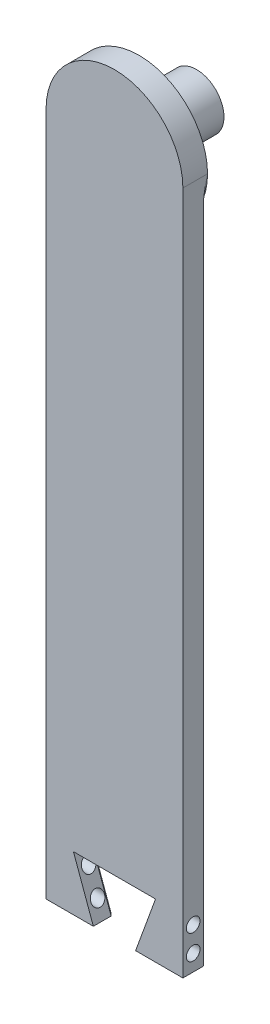
ISO-10303-21;
HEADER;
FILE_DESCRIPTION(('STEP AP214'),'2;1');
FILE_NAME('part.step','',(''),(''),'','','');
FILE_SCHEMA(('AUTOMOTIVE_DESIGN { 1 0 10303 214 1 1 1 1 }'));
ENDSEC;
DATA;
#1=APPLICATION_CONTEXT('core data for automotive mechanical design processes');
#2=APPLICATION_PROTOCOL_DEFINITION('international standard','automotive_design',2000,#1);
#3=PRODUCT_CONTEXT('',#1,'mechanical');
#4=PRODUCT('Part','Part','',(#3));
#5=PRODUCT_RELATED_PRODUCT_CATEGORY('part','',(#4));
#6=PRODUCT_DEFINITION_FORMATION('','',#4);
#7=PRODUCT_DEFINITION_CONTEXT('part definition',#1,'design');
#8=PRODUCT_DEFINITION('design','',#6,#7);
#9=PRODUCT_DEFINITION_SHAPE('','',#8);
#10=(LENGTH_UNIT() NAMED_UNIT(*) SI_UNIT(.MILLI.,.METRE.));
#11=(NAMED_UNIT(*) PLANE_ANGLE_UNIT() SI_UNIT($,.RADIAN.));
#12=(NAMED_UNIT(*) SI_UNIT($,.STERADIAN.) SOLID_ANGLE_UNIT());
#13=UNCERTAINTY_MEASURE_WITH_UNIT(LENGTH_MEASURE(1.E-05),#10,'distance_accuracy_value','');
#14=(GEOMETRIC_REPRESENTATION_CONTEXT(3) GLOBAL_UNCERTAINTY_ASSIGNED_CONTEXT((#13)) GLOBAL_UNIT_ASSIGNED_CONTEXT((#10,
#11,#12)) REPRESENTATION_CONTEXT('',''));
#15=CARTESIAN_POINT('',(0.,0.,0.));
#16=DIRECTION('',(0.,0.,1.));
#17=DIRECTION('',(1.,0.,0.));
#18=AXIS2_PLACEMENT_3D('',#15,#16,#17);
#19=CARTESIAN_POINT('',(-25.,-250.,-25.001));
#20=DIRECTION('',(0.,1.,0.));
#21=DIRECTION('',(0.,0.,1.));
#22=AXIS2_PLACEMENT_3D('',#19,#20,#21);
#23=PLANE('',#22);
#24=DIRECTION('',(-1.,0.,0.));
#25=VECTOR('',#24,1.);
#26=CARTESIAN_POINT('',(-25.,-250.,-2.5));
#27=LINE('',#26,#25);
#28=CARTESIAN_POINT('',(-8.78477308715179,-250.,-2.5));
#29=VERTEX_POINT('',#28);
#30=CARTESIAN_POINT('',(-25.,-250.,-2.50000000000001));
#31=VERTEX_POINT('',#30);
#32=EDGE_CURVE('E424',#29,#31,#27,.T.);
#33=ORIENTED_EDGE('',*,*,#32,.F.);
#34=DIRECTION('',(0.728739444818692,0.,0.684791078771726));
#35=VECTOR('',#34,1.);
#36=CARTESIAN_POINT('',(-50.9089854638326,-250.,-42.0838115267843));
#37=LINE('',#36,#35);
#38=CARTESIAN_POINT('',(-7.72059531467585,-250.,-1.50000000000002));
#39=VERTEX_POINT('',#38);
#40=EDGE_CURVE('E384',#29,#39,#37,.T.);
#41=ORIENTED_EDGE('',*,*,#40,.T.);
#42=DIRECTION('',(0.,0.,1.));
#43=VECTOR('',#42,1.);
#44=CARTESIAN_POINT('',(-7.72059531467585,-250.,-25.001));
#45=LINE('',#44,#43);
#46=CARTESIAN_POINT('',(-7.72059531467585,-250.,5.));
#47=VERTEX_POINT('',#46);
#48=EDGE_CURVE('E421',#39,#47,#45,.T.);
#49=ORIENTED_EDGE('',*,*,#48,.T.);
#50=DIRECTION('',(-1.,0.,0.));
#51=VECTOR('',#50,1.);
#52=CARTESIAN_POINT('',(-25.,-250.,5.));
#53=LINE('',#52,#51);
#54=CARTESIAN_POINT('',(-25.,-250.,5.));
#55=VERTEX_POINT('',#54);
#56=EDGE_CURVE('E171',#47,#55,#53,.T.);
#57=ORIENTED_EDGE('',*,*,#56,.T.);
#58=DIRECTION('',(0.,0.,-1.));
#59=VECTOR('',#58,1.);
#60=CARTESIAN_POINT('',(-25.,-250.,5.));
#61=LINE('',#60,#59);
#62=EDGE_CURVE('E234',#55,#31,#61,.T.);
#63=ORIENTED_EDGE('',*,*,#62,.T.);
#64=EDGE_LOOP('',(#33,#41,#49,#57,#63));
#65=FACE_BOUND('',#64,.T.);
#66=ADVANCED_FACE('F47',(#65),#23,.F.);
#67=CARTESIAN_POINT('',(0.,0.,-25.));
#68=DIRECTION('',(0.,0.,1.));
#69=DIRECTION('',(1.,0.,0.));
#70=AXIS2_PLACEMENT_3D('',#67,#68,#69);
#71=CYLINDRICAL_SURFACE('',#70,10.);
#72=CARTESIAN_POINT('',(0.,0.,-6.));
#73=DIRECTION('',(0.,0.,1.));
#74=DIRECTION('',(1.,0.,0.));
#75=AXIS2_PLACEMENT_3D('',#72,#73,#74);
#76=CIRCLE('',#75,10.);
#77=CARTESIAN_POINT('',(10.,0.,-6.));
#78=VERTEX_POINT('',#77);
#79=EDGE_CURVE('E370',#78,#78,#76,.F.);
#80=ORIENTED_EDGE('',*,*,#79,.T.);
#81=EDGE_LOOP('',(#80));
#82=FACE_BOUND('',#81,.T.);
#83=CARTESIAN_POINT('',(0.,0.,-25.));
#84=DIRECTION('',(0.,0.,-1.));
#85=DIRECTION('',(-1.,0.,0.));
#86=AXIS2_PLACEMENT_3D('',#83,#84,#85);
#87=CIRCLE('',#86,10.);
#88=CARTESIAN_POINT('',(-10.,0.,-25.));
#89=VERTEX_POINT('',#88);
#90=EDGE_CURVE('E210',#89,#89,#87,.T.);
#91=ORIENTED_EDGE('',*,*,#90,.F.);
#92=EDGE_LOOP('',(#91));
#93=FACE_BOUND('',#92,.T.);
#94=ADVANCED_FACE('F308',(#82,#93),#71,.T.);
#95=CARTESIAN_POINT('',(0.,0.,-25.));
#96=DIRECTION('',(0.,0.,-1.));
#97=DIRECTION('',(-1.,0.,0.));
#98=AXIS2_PLACEMENT_3D('',#95,#96,#97);
#99=PLANE('',#98);
#100=CARTESIAN_POINT('',(0.,0.,-25.));
#101=DIRECTION('',(0.,0.,-1.));
#102=DIRECTION('',(-1.,0.,0.));
#103=AXIS2_PLACEMENT_3D('',#100,#101,#102);
#104=CIRCLE('',#103,3.);
#105=CARTESIAN_POINT('',(-2.5,1.6583123951777,-25.));
#106=VERTEX_POINT('',#105);
#107=CARTESIAN_POINT('',(-2.5,-1.6583123951777,-25.));
#108=VERTEX_POINT('',#107);
#109=EDGE_CURVE('E191',#106,#108,#104,.T.);
#110=ORIENTED_EDGE('',*,*,#109,.F.);
#111=DIRECTION('',(0.,1.,0.));
#112=VECTOR('',#111,1.);
#113=CARTESIAN_POINT('',(-2.5,1.6583123951777,-25.));
#114=LINE('',#113,#112);
#115=EDGE_CURVE('E197',#108,#106,#114,.T.);
#116=ORIENTED_EDGE('',*,*,#115,.F.);
#117=EDGE_LOOP('',(#110,#116));
#118=FACE_BOUND('',#117,.T.);
#119=ORIENTED_EDGE('',*,*,#90,.T.);
#120=EDGE_LOOP('',(#119));
#121=FACE_BOUND('',#120,.T.);
#122=ADVANCED_FACE('F314',(#118,#121),#99,.T.);
#123=CARTESIAN_POINT('',(0.,0.,-15.));
#124=DIRECTION('',(0.,0.,-1.));
#125=DIRECTION('',(-1.,0.,0.));
#126=AXIS2_PLACEMENT_3D('',#123,#124,#125);
#127=CYLINDRICAL_SURFACE('',#126,3.);
#128=ORIENTED_EDGE('',*,*,#109,.T.);
#129=DIRECTION('',(0.,0.,-1.));
#130=VECTOR('',#129,1.);
#131=CARTESIAN_POINT('',(-2.5,-1.6583123951777,-15.));
#132=LINE('',#131,#130);
#133=CARTESIAN_POINT('',(-2.5,-1.6583123951777,-15.));
#134=VERTEX_POINT('',#133);
#135=EDGE_CURVE('E201',#134,#108,#132,.T.);
#136=ORIENTED_EDGE('',*,*,#135,.F.);
#137=CARTESIAN_POINT('',(0.,0.,-15.));
#138=DIRECTION('',(0.,0.,-1.));
#139=DIRECTION('',(-1.,0.,0.));
#140=AXIS2_PLACEMENT_3D('',#137,#138,#139);
#141=CIRCLE('',#140,3.);
#142=CARTESIAN_POINT('',(-2.5,1.6583123951777,-15.));
#143=VERTEX_POINT('',#142);
#144=EDGE_CURVE('E192',#143,#134,#141,.T.);
#145=ORIENTED_EDGE('',*,*,#144,.F.);
#146=DIRECTION('',(0.,0.,-1.));
#147=VECTOR('',#146,1.);
#148=CARTESIAN_POINT('',(-2.5,1.6583123951777,-15.));
#149=LINE('',#148,#147);
#150=EDGE_CURVE('E207',#143,#106,#149,.T.);
#151=ORIENTED_EDGE('',*,*,#150,.T.);
#152=EDGE_LOOP('',(#128,#136,#145,#151));
#153=FACE_BOUND('',#152,.T.);
#154=ADVANCED_FACE('F468',(#153),#127,.F.);
#155=CARTESIAN_POINT('',(-2.5,1.6583123951777,-15.));
#156=DIRECTION('',(-1.,0.,0.));
#157=DIRECTION('',(0.,0.,1.));
#158=AXIS2_PLACEMENT_3D('',#155,#156,#157);
#159=PLANE('',#158);
#160=ORIENTED_EDGE('',*,*,#115,.T.);
#161=ORIENTED_EDGE('',*,*,#150,.F.);
#162=DIRECTION('',(0.,1.,0.));
#163=VECTOR('',#162,1.);
#164=CARTESIAN_POINT('',(-2.5,1.6583123951777,-15.));
#165=LINE('',#164,#163);
#166=EDGE_CURVE('E196',#134,#143,#165,.T.);
#167=ORIENTED_EDGE('',*,*,#166,.F.);
#168=ORIENTED_EDGE('',*,*,#135,.T.);
#169=EDGE_LOOP('',(#160,#161,#167,#168));
#170=FACE_BOUND('',#169,.T.);
#171=ADVANCED_FACE('F459',(#170),#159,.F.);
#172=CARTESIAN_POINT('',(0.,0.,-15.));
#173=DIRECTION('',(0.,0.,-1.));
#174=DIRECTION('',(-1.,0.,0.));
#175=AXIS2_PLACEMENT_3D('',#172,#173,#174);
#176=PLANE('',#175);
#177=ORIENTED_EDGE('',*,*,#144,.T.);
#178=ORIENTED_EDGE('',*,*,#166,.T.);
#179=EDGE_LOOP('',(#177,#178));
#180=FACE_BOUND('',#179,.T.);
#181=ADVANCED_FACE('F453',(#180),#176,.T.);
#182=CARTESIAN_POINT('',(0.,0.,-4.));
#183=DIRECTION('',(0.,0.,-1.));
#184=DIRECTION('',(-1.,0.,0.));
#185=AXIS2_PLACEMENT_3D('',#182,#183,#184);
#186=PLANE('',#185);
#187=CARTESIAN_POINT('',(0.,0.,-4.));
#188=DIRECTION('',(0.,0.,-1.));
#189=DIRECTION('',(-1.,0.,0.));
#190=AXIS2_PLACEMENT_3D('',#187,#188,#189);
#191=CIRCLE('',#190,12.);
#192=CARTESIAN_POINT('',(-12.,0.,-4.));
#193=VERTEX_POINT('',#192);
#194=EDGE_CURVE('E170',#193,#193,#191,.T.);
#195=ORIENTED_EDGE('',*,*,#194,.F.);
#196=EDGE_LOOP('',(#195));
#197=FACE_BOUND('',#196,.T.);
#198=CARTESIAN_POINT('',(0.,0.,-4.));
#199=DIRECTION('',(0.,0.,-1.));
#200=DIRECTION('',(-1.,0.,0.));
#201=AXIS2_PLACEMENT_3D('',#198,#199,#200);
#202=CIRCLE('',#201,25.);
#203=CARTESIAN_POINT('',(-25.,0.,-4.));
#204=VERTEX_POINT('',#203);
#205=CARTESIAN_POINT('',(25.,0.,-4.));
#206=VERTEX_POINT('',#205);
#207=EDGE_CURVE('E176',#204,#206,#202,.T.);
#208=ORIENTED_EDGE('',*,*,#207,.T.);
#209=CARTESIAN_POINT('',(0.,0.,-4.));
#210=DIRECTION('',(0.,0.,-1.));
#211=DIRECTION('',(-1.,0.,0.));
#212=AXIS2_PLACEMENT_3D('',#209,#210,#211);
#213=CIRCLE('',#212,25.);
#214=EDGE_CURVE('E246',#206,#204,#213,.T.);
#215=ORIENTED_EDGE('',*,*,#214,.T.);
#216=EDGE_LOOP('',(#208,#215));
#217=FACE_BOUND('',#216,.T.);
#218=ADVANCED_FACE('F451',(#197,#217),#186,.T.);
#219=CARTESIAN_POINT('',(0.,0.,5.));
#220=DIRECTION('',(0.,0.,1.));
#221=DIRECTION('',(1.,0.,0.));
#222=AXIS2_PLACEMENT_3D('',#219,#220,#221);
#223=PLANE('',#222);
#224=DIRECTION('',(0.342020143325673,-0.939692620785907,0.));
#225=VECTOR('',#224,1.);
#226=CARTESIAN_POINT('',(-7.72059531467585,-250.,5.));
#227=LINE('',#226,#225);
#228=CARTESIAN_POINT('',(-15.,-230.,5.));
#229=VERTEX_POINT('',#228);
#230=EDGE_CURVE('E153',#229,#47,#227,.T.);
#231=ORIENTED_EDGE('',*,*,#230,.F.);
#232=DIRECTION('',(-1.,0.,0.));
#233=VECTOR('',#232,1.);
#234=CARTESIAN_POINT('',(-15.,-230.,5.));
#235=LINE('',#234,#233);
#236=CARTESIAN_POINT('',(15.,-230.,5.));
#237=VERTEX_POINT('',#236);
#238=EDGE_CURVE('E162',#237,#229,#235,.T.);
#239=ORIENTED_EDGE('',*,*,#238,.F.);
#240=DIRECTION('',(0.342020143325672,0.939692620785907,0.));
#241=VECTOR('',#240,1.);
#242=CARTESIAN_POINT('',(15.,-230.,5.));
#243=LINE('',#242,#241);
#244=CARTESIAN_POINT('',(7.72059531467585,-250.,5.));
#245=VERTEX_POINT('',#244);
#246=EDGE_CURVE('E146',#245,#237,#243,.T.);
#247=ORIENTED_EDGE('',*,*,#246,.F.);
#248=CARTESIAN_POINT('',(25.,-250.,5.));
#249=VERTEX_POINT('',#248);
#250=EDGE_CURVE('E159',#249,#245,#53,.T.);
#251=ORIENTED_EDGE('',*,*,#250,.F.);
#252=DIRECTION('',(0.,1.,0.));
#253=VECTOR('',#252,1.);
#254=CARTESIAN_POINT('',(25.,0.,5.));
#255=LINE('',#254,#253);
#256=CARTESIAN_POINT('',(25.,0.,5.));
#257=VERTEX_POINT('',#256);
#258=EDGE_CURVE('E225',#249,#257,#255,.T.);
#259=ORIENTED_EDGE('',*,*,#258,.T.);
#260=CARTESIAN_POINT('',(0.,0.,5.));
#261=DIRECTION('',(0.,0.,1.));
#262=DIRECTION('',(1.,0.,0.));
#263=AXIS2_PLACEMENT_3D('',#260,#261,#262);
#264=CIRCLE('',#263,25.);
#265=CARTESIAN_POINT('',(-25.,0.,5.));
#266=VERTEX_POINT('',#265);
#267=EDGE_CURVE('E217',#257,#266,#264,.T.);
#268=ORIENTED_EDGE('',*,*,#267,.T.);
#269=DIRECTION('',(0.,-1.,0.));
#270=VECTOR('',#269,1.);
#271=CARTESIAN_POINT('',(-25.,0.,5.));
#272=LINE('',#271,#270);
#273=EDGE_CURVE('E221',#266,#55,#272,.T.);
#274=ORIENTED_EDGE('',*,*,#273,.T.);
#275=ORIENTED_EDGE('',*,*,#56,.F.);
#276=EDGE_LOOP('',(#231,#239,#247,#251,#259,#268,#274,#275));
#277=FACE_BOUND('',#276,.T.);
#278=ADVANCED_FACE('F158',(#277),#223,.T.);
#279=CARTESIAN_POINT('',(0.,0.,-2.5));
#280=DIRECTION('',(0.,0.,-1.));
#281=DIRECTION('',(-1.,0.,0.));
#282=AXIS2_PLACEMENT_3D('',#279,#280,#281);
#283=PLANE('',#282);
#284=DIRECTION('',(-1.,0.,0.));
#285=VECTOR('',#284,1.);
#286=CARTESIAN_POINT('',(-15.,-229.,-2.5));
#287=LINE('',#286,#285);
#288=CARTESIAN_POINT('',(16.4281480067421,-229.,-2.5));
#289=VERTEX_POINT('',#288);
#290=CARTESIAN_POINT('',(-16.4281480067421,-229.,-2.5));
#291=VERTEX_POINT('',#290);
#292=EDGE_CURVE('E377',#289,#291,#287,.T.);
#293=ORIENTED_EDGE('',*,*,#292,.T.);
#294=DIRECTION('',(0.342020143325673,-0.939692620785907,0.));
#295=VECTOR('',#294,1.);
#296=CARTESIAN_POINT('',(-8.66028793546178,-250.342020143326,-2.5));
#297=LINE('',#296,#295);
#298=EDGE_CURVE('E380',#291,#29,#297,.T.);
#299=ORIENTED_EDGE('',*,*,#298,.T.);
#300=ORIENTED_EDGE('',*,*,#32,.T.);
#301=DIRECTION('',(0.,1.,0.));
#302=VECTOR('',#301,1.);
#303=CARTESIAN_POINT('',(-25.,-250.,-2.5));
#304=LINE('',#303,#302);
#305=CARTESIAN_POINT('',(-25.,-8.78919791562346,-2.5));
#306=VERTEX_POINT('',#305);
#307=EDGE_CURVE('E187',#31,#306,#304,.T.);
#308=ORIENTED_EDGE('',*,*,#307,.T.);
#309=CARTESIAN_POINT('',(0.,0.,-2.5));
#310=DIRECTION('',(0.,0.,-1.));
#311=DIRECTION('',(-1.,0.,0.));
#312=AXIS2_PLACEMENT_3D('',#309,#310,#311);
#313=CIRCLE('',#312,26.5);
#314=CARTESIAN_POINT('',(25.,-8.78919791562347,-2.5));
#315=VERTEX_POINT('',#314);
#316=EDGE_CURVE('E242',#306,#315,#313,.F.);
#317=ORIENTED_EDGE('',*,*,#316,.T.);
#318=DIRECTION('',(0.,-1.,0.));
#319=VECTOR('',#318,1.);
#320=CARTESIAN_POINT('',(25.,0.,-2.5));
#321=LINE('',#320,#319);
#322=CARTESIAN_POINT('',(25.,-250.,-2.50000000000001));
#323=VERTEX_POINT('',#322);
#324=EDGE_CURVE('E183',#315,#323,#321,.T.);
#325=ORIENTED_EDGE('',*,*,#324,.T.);
#326=CARTESIAN_POINT('',(8.78477308715179,-250.,-2.5));
#327=VERTEX_POINT('',#326);
#328=EDGE_CURVE('E178',#323,#327,#27,.T.);
#329=ORIENTED_EDGE('',*,*,#328,.T.);
#330=DIRECTION('',(0.342020143325672,0.939692620785907,0.));
#331=VECTOR('',#330,1.);
#332=CARTESIAN_POINT('',(15.9396926207859,-230.342020143326,-2.5));
#333=LINE('',#332,#331);
#334=EDGE_CURVE('E374',#327,#289,#333,.T.);
#335=ORIENTED_EDGE('',*,*,#334,.T.);
#336=EDGE_LOOP('',(#293,#299,#300,#308,#317,#325,#329,#335));
#337=FACE_BOUND('',#336,.T.);
#338=ADVANCED_FACE('F432',(#337),#283,.T.);
#339=CARTESIAN_POINT('',(25.,0.,5.));
#340=DIRECTION('',(-1.,0.,0.));
#341=DIRECTION('',(0.,-1.,0.));
#342=AXIS2_PLACEMENT_3D('',#339,#340,#341);
#343=PLANE('',#342);
#344=CARTESIAN_POINT('',(25.0000000000001,-244.,1.25));
#345=DIRECTION('',(-1.,0.,0.));
#346=DIRECTION('',(0.,-1.,0.));
#347=AXIS2_PLACEMENT_3D('',#344,#345,#346);
#348=CIRCLE('',#347,2.5);
#349=CARTESIAN_POINT('',(25.0000000000001,-246.5,1.25));
#350=VERTEX_POINT('',#349);
#351=EDGE_CURVE('E355',#350,#350,#348,.T.);
#352=ORIENTED_EDGE('',*,*,#351,.T.);
#353=EDGE_LOOP('',(#352));
#354=FACE_BOUND('',#353,.T.);
#355=CARTESIAN_POINT('',(25.0000000000001,-235.,1.25));
#356=DIRECTION('',(-1.,0.,0.));
#357=DIRECTION('',(0.,-1.,0.));
#358=AXIS2_PLACEMENT_3D('',#355,#356,#357);
#359=CIRCLE('',#358,2.5);
#360=CARTESIAN_POINT('',(25.0000000000001,-237.5,1.25));
#361=VERTEX_POINT('',#360);
#362=EDGE_CURVE('E400',#361,#361,#359,.T.);
#363=ORIENTED_EDGE('',*,*,#362,.T.);
#364=EDGE_LOOP('',(#363));
#365=FACE_BOUND('',#364,.T.);
#366=ORIENTED_EDGE('',*,*,#324,.F.);
#367=CARTESIAN_POINT('',(25.,-8.78919791562347,-2.5));
#368=CARTESIAN_POINT('',(25.,-8.6633488367976,-2.50000832878001));
#369=CARTESIAN_POINT('',(25.,-8.53751170109532,-2.50174124978233));
#370=CARTESIAN_POINT('',(25.,-8.2859346134982,-2.50832761207099));
#371=CARTESIAN_POINT('',(25.,-8.16019465085539,-2.51318063592021));
#372=CARTESIAN_POINT('',(25.,-7.78335283227237,-2.53191916129215));
#373=CARTESIAN_POINT('',(25.,-7.53245577547394,-2.54998503412468));
#374=CARTESIAN_POINT('',(25.,-7.03230891535994,-2.59516488619941));
#375=CARTESIAN_POINT('',(25.,-6.78305641211524,-2.62225009810682));
#376=CARTESIAN_POINT('',(25.,-6.28544423489765,-2.68393054667393));
#377=CARTESIAN_POINT('',(25.,-6.03708475105059,-2.71852729626276));
#378=CARTESIAN_POINT('',(25.,-5.30416321394894,-2.82997018282594));
#379=CARTESIAN_POINT('',(25.,-4.82093808860218,-2.91557130089394));
#380=CARTESIAN_POINT('',(25.,-3.85765106813043,-3.10285103850383));
#381=CARTESIAN_POINT('',(25.,-3.37758961371832,-3.20453185068083));
#382=CARTESIAN_POINT('',(25.,-1.93959076090943,-3.52490484973429));
#383=CARTESIAN_POINT('',(25.,-0.985086872761999,-3.75870402984026));
#384=CARTESIAN_POINT('',(25.,-0.0204764944202987,-3.99498432851503));
#385=CARTESIAN_POINT('',(25.,-0.0102382423696275,-3.99749217823576));
#386=CARTESIAN_POINT('',(25.,0.,-4.));
#387=B_SPLINE_CURVE_WITH_KNOTS('',3,(#367,#368,#369,#370,#371,#372,#373,#374,#375,#376,#377,
#378,#379,#380,#381,#382,#383,#384,#385,#386),.UNSPECIFIED.,.F.,.F.,(4,2,2,2,2,2,2,2,2,4),(0.,
0.377516744867336,0.754982992452004,1.50939618450671,2.26142584916094,3.01360712389357,
4.48538362854934,5.95736099871148,8.90511528446614,8.93673806106804),.UNSPECIFIED.);
#388=EDGE_CURVE('E249',#315,#206,#387,.T.);
#389=ORIENTED_EDGE('',*,*,#388,.T.);
#390=DIRECTION('',(0.,0.,-1.));
#391=VECTOR('',#390,1.);
#392=CARTESIAN_POINT('',(25.,0.,5.));
#393=LINE('',#392,#391);
#394=EDGE_CURVE('E228',#257,#206,#393,.T.);
#395=ORIENTED_EDGE('',*,*,#394,.F.);
#396=ORIENTED_EDGE('',*,*,#258,.F.);
#397=DIRECTION('',(0.,0.,-1.));
#398=VECTOR('',#397,1.);
#399=CARTESIAN_POINT('',(25.,-250.,5.));
#400=LINE('',#399,#398);
#401=EDGE_CURVE('E168',#249,#323,#400,.T.);
#402=ORIENTED_EDGE('',*,*,#401,.T.);
#403=EDGE_LOOP('',(#366,#389,#395,#396,#402));
#404=FACE_BOUND('',#403,.T.);
#405=ADVANCED_FACE('F266',(#354,#365,#404),#343,.F.);
#406=CARTESIAN_POINT('',(0.,0.,5.));
#407=DIRECTION('',(0.,0.,-1.));
#408=DIRECTION('',(-1.,0.,0.));
#409=AXIS2_PLACEMENT_3D('',#406,#407,#408);
#410=CYLINDRICAL_SURFACE('',#409,25.);
#411=ORIENTED_EDGE('',*,*,#207,.F.);
#412=DIRECTION('',(0.,0.,-1.));
#413=VECTOR('',#412,1.);
#414=CARTESIAN_POINT('',(-25.,0.,5.));
#415=LINE('',#414,#413);
#416=EDGE_CURVE('E238',#266,#204,#415,.T.);
#417=ORIENTED_EDGE('',*,*,#416,.F.);
#418=ORIENTED_EDGE('',*,*,#267,.F.);
#419=ORIENTED_EDGE('',*,*,#394,.T.);
#420=EDGE_LOOP('',(#411,#417,#418,#419));
#421=FACE_BOUND('',#420,.T.);
#422=ADVANCED_FACE('F276',(#421),#410,.T.);
#423=CARTESIAN_POINT('',(-25.,0.,5.));
#424=DIRECTION('',(1.,0.,0.));
#425=DIRECTION('',(0.,1.,0.));
#426=AXIS2_PLACEMENT_3D('',#423,#424,#425);
#427=PLANE('',#426);
#428=CARTESIAN_POINT('',(-25.,-244.,1.25));
#429=DIRECTION('',(-1.,0.,0.));
#430=DIRECTION('',(0.,-1.,0.));
#431=AXIS2_PLACEMENT_3D('',#428,#429,#430);
#432=CIRCLE('',#431,2.5);
#433=CARTESIAN_POINT('',(-25.,-246.5,1.25));
#434=VERTEX_POINT('',#433);
#435=EDGE_CURVE('E361',#434,#434,#432,.T.);
#436=ORIENTED_EDGE('',*,*,#435,.F.);
#437=EDGE_LOOP('',(#436));
#438=FACE_BOUND('',#437,.T.);
#439=CARTESIAN_POINT('',(-25.,-235.,1.25));
#440=DIRECTION('',(-1.,0.,0.));
#441=DIRECTION('',(0.,-1.,0.));
#442=AXIS2_PLACEMENT_3D('',#439,#440,#441);
#443=CIRCLE('',#442,2.5);
#444=CARTESIAN_POINT('',(-25.,-237.5,1.25));
#445=VERTEX_POINT('',#444);
#446=EDGE_CURVE('E405',#445,#445,#443,.T.);
#447=ORIENTED_EDGE('',*,*,#446,.F.);
#448=EDGE_LOOP('',(#447));
#449=FACE_BOUND('',#448,.T.);
#450=ORIENTED_EDGE('',*,*,#307,.F.);
#451=ORIENTED_EDGE('',*,*,#62,.F.);
#452=ORIENTED_EDGE('',*,*,#273,.F.);
#453=ORIENTED_EDGE('',*,*,#416,.T.);
#454=CARTESIAN_POINT('',(-25.,-8.78919791562348,-2.5));
#455=CARTESIAN_POINT('',(-25.,-8.6633488367976,-2.50000832878001));
#456=CARTESIAN_POINT('',(-25.,-8.53751170109532,-2.50174124978233));
#457=CARTESIAN_POINT('',(-25.,-8.2859346134982,-2.50832761207099));
#458=CARTESIAN_POINT('',(-25.,-8.16019465085539,-2.51318063592021));
#459=CARTESIAN_POINT('',(-25.,-7.78335283227236,-2.53191916129215));
#460=CARTESIAN_POINT('',(-25.,-7.53245577547393,-2.54998503412469));
#461=CARTESIAN_POINT('',(-25.,-7.03230891535993,-2.59516488619941));
#462=CARTESIAN_POINT('',(-25.,-6.78305641211523,-2.62225009810682));
#463=CARTESIAN_POINT('',(-25.,-6.28544423489765,-2.68393054667393));
#464=CARTESIAN_POINT('',(-25.,-6.03708475105059,-2.71852729626276));
#465=CARTESIAN_POINT('',(-25.,-5.30416321394895,-2.82997018282595));
#466=CARTESIAN_POINT('',(-25.,-4.82093808860219,-2.91557130089394));
#467=CARTESIAN_POINT('',(-25.,-3.85765106813044,-3.10285103850382));
#468=CARTESIAN_POINT('',(-25.,-3.37758961371833,-3.2045318506808));
#469=CARTESIAN_POINT('',(-25.,-1.93959076090946,-3.52490484973434));
#470=CARTESIAN_POINT('',(-25.,-0.98508687276208,-3.75870402984056));
#471=CARTESIAN_POINT('',(-25.,-0.0204764944203065,-3.99498432851504));
#472=CARTESIAN_POINT('',(-25.,-0.0102382423696345,-3.99749217823576));
#473=CARTESIAN_POINT('',(-25.,0.,-4.));
#474=B_SPLINE_CURVE_WITH_KNOTS('',3,(#454,#455,#456,#457,#458,#459,#460,#461,#462,#463,#464,
#465,#466,#467,#468,#469,#470,#471,#472,#473),.UNSPECIFIED.,.F.,.F.,(4,2,2,2,2,2,2,2,2,4),(0.,
0.377516744867341,0.754982992452013,1.50939618450673,2.26142584916095,3.01360712389357,
4.48538362854934,5.95736099871147,8.90511528446613,8.93673806106804),.UNSPECIFIED.);
#475=EDGE_CURVE('E259',#204,#306,#474,.F.);
#476=ORIENTED_EDGE('',*,*,#475,.T.);
#477=EDGE_LOOP('',(#450,#451,#452,#453,#476));
#478=FACE_BOUND('',#477,.T.);
#479=ADVANCED_FACE('F274',(#438,#449,#478),#427,.F.);
#480=CARTESIAN_POINT('',(0.,0.,-4.));
#481=DIRECTION('',(0.,0.,-1.));
#482=DIRECTION('',(-1.,0.,0.));
#483=AXIS2_PLACEMENT_3D('',#480,#481,#482);
#484=TOROIDAL_SURFACE('',#483,26.5,1.5);
#485=ORIENTED_EDGE('',*,*,#475,.F.);
#486=ORIENTED_EDGE('',*,*,#214,.F.);
#487=ORIENTED_EDGE('',*,*,#388,.F.);
#488=ORIENTED_EDGE('',*,*,#316,.F.);
#489=EDGE_LOOP('',(#485,#486,#487,#488));
#490=FACE_BOUND('',#489,.T.);
#491=ADVANCED_FACE('F269',(#490),#484,.F.);
#492=DIRECTION('',(0.,0.,1.));
#493=VECTOR('',#492,1.);
#494=CARTESIAN_POINT('',(7.72059531467585,-250.,-25.001));
#495=LINE('',#494,#493);
#496=CARTESIAN_POINT('',(7.72059531467585,-250.,-1.5));
#497=VERTEX_POINT('',#496);
#498=EDGE_CURVE('E143',#497,#245,#495,.T.);
#499=ORIENTED_EDGE('',*,*,#498,.F.);
#500=DIRECTION('',(0.728739444818688,0.,-0.684791078771731));
#501=VECTOR('',#500,1.);
#502=CARTESIAN_POINT('',(50.908985463832,-250.,-42.0838115267843));
#503=LINE('',#502,#501);
#504=EDGE_CURVE('E11',#497,#327,#503,.T.);
#505=ORIENTED_EDGE('',*,*,#504,.T.);
#506=ORIENTED_EDGE('',*,*,#328,.F.);
#507=ORIENTED_EDGE('',*,*,#401,.F.);
#508=ORIENTED_EDGE('',*,*,#250,.T.);
#509=EDGE_LOOP('',(#499,#505,#506,#507,#508));
#510=FACE_BOUND('',#509,.T.);
#511=ADVANCED_FACE('F166',(#510),#23,.F.);
#512=CARTESIAN_POINT('',(-7.72059531467585,-250.,-25.001));
#513=DIRECTION('',(-0.939692620785907,-0.342020143325673,0.));
#514=DIRECTION('',(0.342020143325673,-0.939692620785907,0.));
#515=AXIS2_PLACEMENT_3D('',#512,#513,#514);
#516=PLANE('',#515);
#517=CARTESIAN_POINT('',(-9.90441672027309,-244.,1.25));
#518=DIRECTION('',(-0.939692620785907,-0.342020143325673,0.));
#519=DIRECTION('',(-0.342020143325673,0.939692620785907,0.));
#520=AXIS2_PLACEMENT_3D('',#517,#518,#519);
#521=ELLIPSE('',#520,2.66044443118979,2.5);
#522=CARTESIAN_POINT('',(-10.8143423059386,-241.5,1.25));
#523=VERTEX_POINT('',#522);
#524=EDGE_CURVE('E164',#523,#523,#521,.T.);
#525=ORIENTED_EDGE('',*,*,#524,.T.);
#526=EDGE_LOOP('',(#525));
#527=FACE_BOUND('',#526,.T.);
#528=CARTESIAN_POINT('',(-13.180148828669,-235.,1.25));
#529=DIRECTION('',(-0.939692620785907,-0.342020143325673,0.));
#530=DIRECTION('',(-0.342020143325673,0.939692620785907,0.));
#531=AXIS2_PLACEMENT_3D('',#528,#529,#530);
#532=ELLIPSE('',#531,2.66044443118979,2.5);
#533=CARTESIAN_POINT('',(-14.0900744143345,-232.5,1.25));
#534=VERTEX_POINT('',#533);
#535=EDGE_CURVE('E354',#534,#534,#532,.T.);
#536=ORIENTED_EDGE('',*,*,#535,.T.);
#537=EDGE_LOOP('',(#536));
#538=FACE_BOUND('',#537,.T.);
#539=ORIENTED_EDGE('',*,*,#48,.F.);
#540=DIRECTION('',(-0.342020143325673,0.939692620785907,0.));
#541=VECTOR('',#540,1.);
#542=CARTESIAN_POINT('',(-15.,-230.,-1.50000000000001));
#543=LINE('',#542,#541);
#544=CARTESIAN_POINT('',(-15.,-230.,-1.5));
#545=VERTEX_POINT('',#544);
#546=EDGE_CURVE('E387',#39,#545,#543,.T.);
#547=ORIENTED_EDGE('',*,*,#546,.T.);
#548=DIRECTION('',(0.,0.,1.));
#549=VECTOR('',#548,1.);
#550=CARTESIAN_POINT('',(-15.,-230.,-25.001));
#551=LINE('',#550,#549);
#552=EDGE_CURVE('E425',#545,#229,#551,.T.);
#553=ORIENTED_EDGE('',*,*,#552,.T.);
#554=ORIENTED_EDGE('',*,*,#230,.T.);
#555=EDGE_LOOP('',(#539,#547,#553,#554));
#556=FACE_BOUND('',#555,.T.);
#557=ADVANCED_FACE('F321',(#527,#538,#556),#516,.F.);
#558=CARTESIAN_POINT('',(-15.,-230.,-25.001));
#559=DIRECTION('',(0.,1.,0.));
#560=DIRECTION('',(0.,0.,1.));
#561=AXIS2_PLACEMENT_3D('',#558,#559,#560);
#562=PLANE('',#561);
#563=ORIENTED_EDGE('',*,*,#552,.F.);
#564=DIRECTION('',(1.,0.,0.));
#565=VECTOR('',#564,1.);
#566=CARTESIAN_POINT('',(15.,-230.,-1.5));
#567=LINE('',#566,#565);
#568=CARTESIAN_POINT('',(15.,-230.,-1.5));
#569=VERTEX_POINT('',#568);
#570=EDGE_CURVE('E73',#545,#569,#567,.T.);
#571=ORIENTED_EDGE('',*,*,#570,.T.);
#572=DIRECTION('',(0.,0.,1.));
#573=VECTOR('',#572,1.);
#574=CARTESIAN_POINT('',(15.,-230.,-25.001));
#575=LINE('',#574,#573);
#576=EDGE_CURVE('E152',#569,#237,#575,.T.);
#577=ORIENTED_EDGE('',*,*,#576,.T.);
#578=ORIENTED_EDGE('',*,*,#238,.T.);
#579=EDGE_LOOP('',(#563,#571,#577,#578));
#580=FACE_BOUND('',#579,.T.);
#581=ADVANCED_FACE('F325',(#580),#562,.F.);
#582=CARTESIAN_POINT('',(15.,-230.,-25.001));
#583=DIRECTION('',(0.939692620785907,-0.342020143325672,0.));
#584=DIRECTION('',(0.342020143325672,0.939692620785907,0.));
#585=AXIS2_PLACEMENT_3D('',#582,#583,#584);
#586=PLANE('',#585);
#587=CARTESIAN_POINT('',(9.90441672027311,-244.,1.25));
#588=DIRECTION('',(0.939692620785907,-0.342020143325672,0.));
#589=DIRECTION('',(-0.342020143325672,-0.939692620785907,0.));
#590=AXIS2_PLACEMENT_3D('',#587,#588,#589);
#591=ELLIPSE('',#590,2.66044443118979,2.5);
#592=CARTESIAN_POINT('',(8.99449113460759,-246.5,1.25));
#593=VERTEX_POINT('',#592);
#594=EDGE_CURVE('E348',#593,#593,#591,.T.);
#595=ORIENTED_EDGE('',*,*,#594,.T.);
#596=EDGE_LOOP('',(#595));
#597=FACE_BOUND('',#596,.T.);
#598=CARTESIAN_POINT('',(13.180148828669,-235.,1.25));
#599=DIRECTION('',(0.939692620785907,-0.342020143325672,0.));
#600=DIRECTION('',(-0.342020143325672,-0.939692620785907,0.));
#601=AXIS2_PLACEMENT_3D('',#598,#599,#600);
#602=ELLIPSE('',#601,2.66044443118979,2.5);
#603=CARTESIAN_POINT('',(12.2702232430035,-237.5,1.25));
#604=VERTEX_POINT('',#603);
#605=EDGE_CURVE('E351',#604,#604,#602,.T.);
#606=ORIENTED_EDGE('',*,*,#605,.T.);
#607=EDGE_LOOP('',(#606));
#608=FACE_BOUND('',#607,.T.);
#609=ORIENTED_EDGE('',*,*,#576,.F.);
#610=DIRECTION('',(-0.342020143325672,-0.939692620785907,0.));
#611=VECTOR('',#610,1.);
#612=CARTESIAN_POINT('',(7.72059531467587,-250.,-1.49999999999999));
#613=LINE('',#612,#611);
#614=EDGE_CURVE('E58',#569,#497,#613,.T.);
#615=ORIENTED_EDGE('',*,*,#614,.T.);
#616=ORIENTED_EDGE('',*,*,#498,.T.);
#617=ORIENTED_EDGE('',*,*,#246,.T.);
#618=EDGE_LOOP('',(#609,#615,#616,#617));
#619=FACE_BOUND('',#618,.T.);
#620=ADVANCED_FACE('F145',(#597,#608,#619),#586,.F.);
#621=CARTESIAN_POINT('',(25.0000000000001,-235.,1.25));
#622=DIRECTION('',(-1.,0.,0.));
#623=DIRECTION('',(0.,-1.,0.));
#624=AXIS2_PLACEMENT_3D('',#621,#622,#623);
#625=CYLINDRICAL_SURFACE('',#624,2.5);
#626=ORIENTED_EDGE('',*,*,#362,.F.);
#627=EDGE_LOOP('',(#626));
#628=FACE_BOUND('',#627,.T.);
#629=ORIENTED_EDGE('',*,*,#605,.F.);
#630=EDGE_LOOP('',(#629));
#631=FACE_BOUND('',#630,.T.);
#632=ADVANCED_FACE('F338',(#628,#631),#625,.F.);
#633=CARTESIAN_POINT('',(25.0000000000001,-244.,1.25));
#634=DIRECTION('',(-1.,0.,0.));
#635=DIRECTION('',(0.,-1.,0.));
#636=AXIS2_PLACEMENT_3D('',#633,#634,#635);
#637=CYLINDRICAL_SURFACE('',#636,2.5);
#638=ORIENTED_EDGE('',*,*,#351,.F.);
#639=EDGE_LOOP('',(#638));
#640=FACE_BOUND('',#639,.T.);
#641=ORIENTED_EDGE('',*,*,#594,.F.);
#642=EDGE_LOOP('',(#641));
#643=FACE_BOUND('',#642,.T.);
#644=ADVANCED_FACE('F343',(#640,#643),#637,.F.);
#645=ORIENTED_EDGE('',*,*,#446,.T.);
#646=EDGE_LOOP('',(#645));
#647=FACE_BOUND('',#646,.T.);
#648=ORIENTED_EDGE('',*,*,#535,.F.);
#649=EDGE_LOOP('',(#648));
#650=FACE_BOUND('',#649,.T.);
#651=ADVANCED_FACE('F335',(#647,#650),#625,.F.);
#652=ORIENTED_EDGE('',*,*,#435,.T.);
#653=EDGE_LOOP('',(#652));
#654=FACE_BOUND('',#653,.T.);
#655=ORIENTED_EDGE('',*,*,#524,.F.);
#656=EDGE_LOOP('',(#655));
#657=FACE_BOUND('',#656,.T.);
#658=ADVANCED_FACE('F285',(#654,#657),#637,.F.);
#659=CARTESIAN_POINT('',(0.,0.,-5.));
#660=DIRECTION('',(0.,0.,1.));
#661=DIRECTION('',(1.,0.,0.));
#662=AXIS2_PLACEMENT_3D('',#659,#660,#661);
#663=CONICAL_SURFACE('',#662,11.,0.785398163397454);
#664=ORIENTED_EDGE('',*,*,#194,.T.);
#665=EDGE_LOOP('',(#664));
#666=FACE_BOUND('',#665,.T.);
#667=CARTESIAN_POINT('',(0.,0.,-5.));
#668=DIRECTION('',(0.,0.,1.));
#669=DIRECTION('',(1.,0.,0.));
#670=AXIS2_PLACEMENT_3D('',#667,#668,#669);
#671=CIRCLE('',#670,11.);
#672=CARTESIAN_POINT('',(11.,0.,-5.));
#673=VERTEX_POINT('',#672);
#674=EDGE_CURVE('E366',#673,#673,#671,.F.);
#675=ORIENTED_EDGE('',*,*,#674,.F.);
#676=EDGE_LOOP('',(#675));
#677=FACE_BOUND('',#676,.T.);
#678=ADVANCED_FACE('F278',(#666,#677),#663,.T.);
#679=CARTESIAN_POINT('',(0.,0.,-6.));
#680=DIRECTION('',(0.,0.,1.));
#681=DIRECTION('',(1.,0.,0.));
#682=AXIS2_PLACEMENT_3D('',#679,#680,#681);
#683=TOROIDAL_SURFACE('',#682,11.,1.);
#684=ORIENTED_EDGE('',*,*,#674,.T.);
#685=EDGE_LOOP('',(#684));
#686=FACE_BOUND('',#685,.T.);
#687=ORIENTED_EDGE('',*,*,#79,.F.);
#688=EDGE_LOOP('',(#687));
#689=FACE_BOUND('',#688,.T.);
#690=ADVANCED_FACE('F284',(#686,#689),#683,.F.);
#691=CARTESIAN_POINT('',(88.1056010581308,-32.0678162572928,-2.5));
#692=DIRECTION('',(-0.66446302438867,0.241844762647976,-0.707106781186552));
#693=DIRECTION('',(-0.342020143325672,-0.939692620785907,0.));
#694=AXIS2_PLACEMENT_3D('',#691,#692,#693);
#695=PLANE('',#694);
#696=ORIENTED_EDGE('',*,*,#504,.F.);
#697=ORIENTED_EDGE('',*,*,#614,.F.);
#698=DIRECTION('',(0.710564775461635,0.497542812164519,-0.49754281216452));
#699=VECTOR('',#698,1.);
#700=CARTESIAN_POINT('',(8.13353829131382,-234.80794824925,3.30794824925033));
#701=LINE('',#700,#699);
#702=EDGE_CURVE('E52',#289,#569,#701,.F.);
#703=ORIENTED_EDGE('',*,*,#702,.F.);
#704=ORIENTED_EDGE('',*,*,#334,.F.);
#705=EDGE_LOOP('',(#696,#697,#703,#704));
#706=FACE_BOUND('',#705,.T.);
#707=ADVANCED_FACE('F50',(#706),#695,.T.);
#708=CARTESIAN_POINT('',(0.,-229.,-2.5));
#709=DIRECTION('',(0.,-0.707106781186548,-0.707106781186547));
#710=DIRECTION('',(1.,0.,0.));
#711=AXIS2_PLACEMENT_3D('',#708,#709,#710);
#712=PLANE('',#711);
#713=ORIENTED_EDGE('',*,*,#702,.T.);
#714=ORIENTED_EDGE('',*,*,#570,.F.);
#715=DIRECTION('',(-0.710564775461638,0.497542812164517,-0.497542812164517));
#716=VECTOR('',#715,1.);
#717=CARTESIAN_POINT('',(-122.240953536209,-154.909075929151,-76.5909240708493));
#718=LINE('',#717,#716);
#719=EDGE_CURVE('E393',#291,#545,#718,.F.);
#720=ORIENTED_EDGE('',*,*,#719,.F.);
#721=ORIENTED_EDGE('',*,*,#292,.F.);
#722=EDGE_LOOP('',(#713,#714,#720,#721));
#723=FACE_BOUND('',#722,.T.);
#724=ADVANCED_FACE('F296',(#723),#712,.T.);
#725=CARTESIAN_POINT('',(-88.105601058131,-32.0678162572929,-2.5));
#726=DIRECTION('',(0.664463024388665,0.241844762647975,-0.707106781186557));
#727=DIRECTION('',(-0.342020143325673,0.939692620785907,0.));
#728=AXIS2_PLACEMENT_3D('',#725,#726,#727);
#729=PLANE('',#728);
#730=ORIENTED_EDGE('',*,*,#719,.T.);
#731=ORIENTED_EDGE('',*,*,#546,.F.);
#732=ORIENTED_EDGE('',*,*,#40,.F.);
#733=ORIENTED_EDGE('',*,*,#298,.F.);
#734=EDGE_LOOP('',(#730,#731,#732,#733));
#735=FACE_BOUND('',#734,.T.);
#736=ADVANCED_FACE('F291',(#735),#729,.T.);
#737=CLOSED_SHELL('',(#66,#94,#122,#154,#171,#181,#218,#278,#338,#405,#422,#479,#491,#511,#557,
#581,#620,#632,#644,#651,#658,#678,#690,#707,#724,#736));
#738=MANIFOLD_SOLID_BREP('B2',#737);
#739=ADVANCED_BREP_SHAPE_REPRESENTATION('',(#18,#738),#14);
#740=SHAPE_DEFINITION_REPRESENTATION(#9,#739);
ENDSEC;
END-ISO-10303-21;
